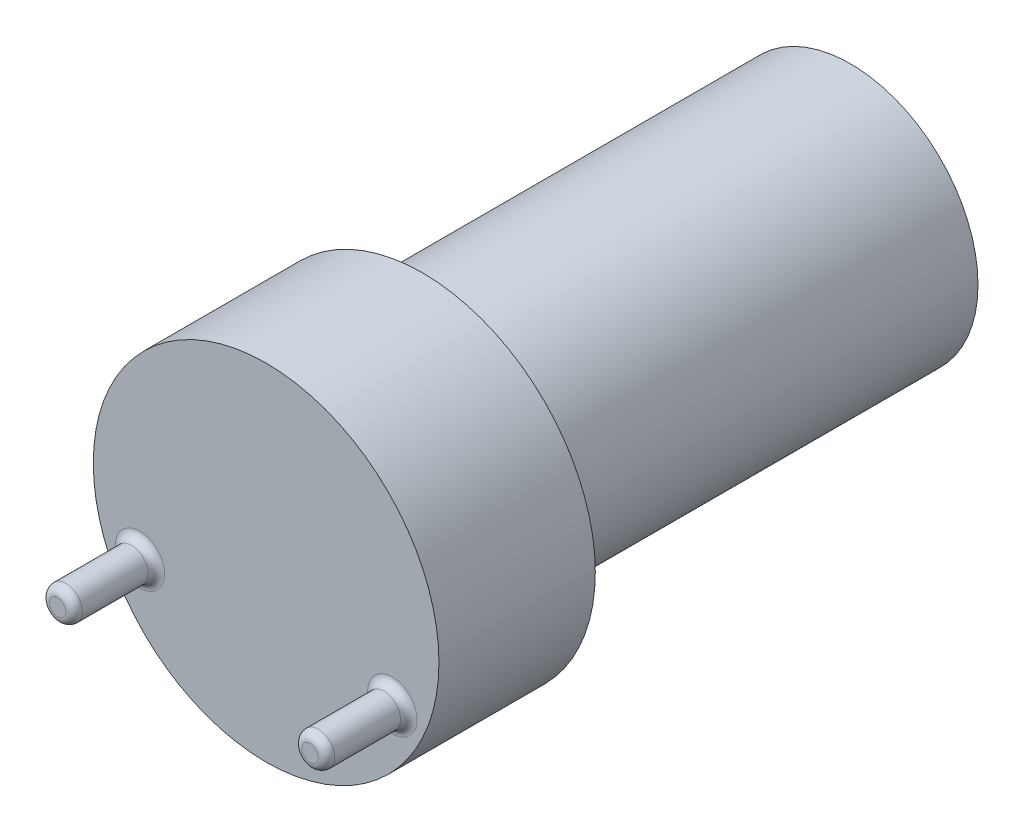
ISO-10303-21;
HEADER;
FILE_DESCRIPTION(('STEP AP214'),'2;1');
FILE_NAME('part.step','',(''),(''),'','','');
FILE_SCHEMA(('AUTOMOTIVE_DESIGN { 1 0 10303 214 1 1 1 1 }'));
ENDSEC;
DATA;
#1=APPLICATION_CONTEXT('core data for automotive mechanical design processes');
#2=APPLICATION_PROTOCOL_DEFINITION('international standard','automotive_design',2000,#1);
#3=PRODUCT_CONTEXT('',#1,'mechanical');
#4=PRODUCT('Part','Part','',(#3));
#5=PRODUCT_RELATED_PRODUCT_CATEGORY('part','',(#4));
#6=PRODUCT_DEFINITION_FORMATION('','',#4);
#7=PRODUCT_DEFINITION_CONTEXT('part definition',#1,'design');
#8=PRODUCT_DEFINITION('design','',#6,#7);
#9=PRODUCT_DEFINITION_SHAPE('','',#8);
#10=(LENGTH_UNIT() NAMED_UNIT(*) SI_UNIT(.MILLI.,.METRE.));
#11=(NAMED_UNIT(*) PLANE_ANGLE_UNIT() SI_UNIT($,.RADIAN.));
#12=(NAMED_UNIT(*) SI_UNIT($,.STERADIAN.) SOLID_ANGLE_UNIT());
#13=UNCERTAINTY_MEASURE_WITH_UNIT(LENGTH_MEASURE(1.E-05),#10,'distance_accuracy_value','');
#14=(GEOMETRIC_REPRESENTATION_CONTEXT(3) GLOBAL_UNCERTAINTY_ASSIGNED_CONTEXT((#13)) GLOBAL_UNIT_ASSIGNED_CONTEXT((#10,
#11,#12)) REPRESENTATION_CONTEXT('',''));
#15=CARTESIAN_POINT('',(0.,0.,0.));
#16=DIRECTION('',(0.,0.,1.));
#17=DIRECTION('',(1.,0.,0.));
#18=AXIS2_PLACEMENT_3D('',#15,#16,#17);
#19=CARTESIAN_POINT('',(0.,0.,52.));
#20=DIRECTION('',(0.,0.,-1.));
#21=DIRECTION('',(-1.,0.,0.));
#22=AXIS2_PLACEMENT_3D('',#19,#20,#21);
#23=CYLINDRICAL_SURFACE('',#22,15.5);
#24=CARTESIAN_POINT('',(0.,0.,52.));
#25=DIRECTION('',(0.,0.,1.));
#26=DIRECTION('',(1.,0.,0.));
#27=AXIS2_PLACEMENT_3D('',#24,#25,#26);
#28=CIRCLE('',#27,15.5);
#29=CARTESIAN_POINT('',(-15.5,0.,52.));
#30=VERTEX_POINT('',#29);
#31=EDGE_CURVE('E62',#30,#30,#28,.T.);
#32=CARTESIAN_POINT('',(0.,0.,0.));
#33=DIRECTION('',(0.,0.,1.));
#34=DIRECTION('',(1.,0.,0.));
#35=AXIS2_PLACEMENT_3D('',#32,#33,#34);
#36=CIRCLE('',#35,15.5);
#37=CARTESIAN_POINT('',(-15.5,0.,0.));
#38=VERTEX_POINT('',#37);
#39=EDGE_CURVE('E63',#38,#38,#36,.T.);
#40=CARTESIAN_POINT('',(-15.5,0.,52.));
#41=CARTESIAN_POINT('',(-15.5,0.,51.4583333333333));
#42=CARTESIAN_POINT('',(-15.5,0.,50.9166666666667));
#43=CARTESIAN_POINT('',(-15.5,0.,49.8333333333333));
#44=CARTESIAN_POINT('',(-15.5,0.,49.2916666666667));
#45=CARTESIAN_POINT('',(-15.5,0.,48.2083333333333));
#46=CARTESIAN_POINT('',(-15.5,0.,47.6666666666667));
#47=CARTESIAN_POINT('',(-15.5,0.,46.5833333333333));
#48=CARTESIAN_POINT('',(-15.5,0.,46.0416666666667));
#49=CARTESIAN_POINT('',(-15.5,0.,44.9583333333333));
#50=CARTESIAN_POINT('',(-15.5,0.,44.4166666666667));
#51=CARTESIAN_POINT('',(-15.5,0.,43.3333333333333));
#52=CARTESIAN_POINT('',(-15.5,0.,42.7916666666667));
#53=CARTESIAN_POINT('',(-15.5,0.,41.7083333333333));
#54=CARTESIAN_POINT('',(-15.5,0.,41.1666666666667));
#55=CARTESIAN_POINT('',(-15.5,0.,40.0833333333333));
#56=CARTESIAN_POINT('',(-15.5,0.,39.5416666666667));
#57=CARTESIAN_POINT('',(-15.5,0.,38.4583333333333));
#58=CARTESIAN_POINT('',(-15.5,0.,37.9166666666667));
#59=CARTESIAN_POINT('',(-15.5,0.,36.8333333333333));
#60=CARTESIAN_POINT('',(-15.5,0.,36.2916666666667));
#61=CARTESIAN_POINT('',(-15.5,0.,35.2083333333333));
#62=CARTESIAN_POINT('',(-15.5,0.,34.6666666666667));
#63=CARTESIAN_POINT('',(-15.5,0.,33.5833333333333));
#64=CARTESIAN_POINT('',(-15.5,0.,33.0416666666667));
#65=CARTESIAN_POINT('',(-15.5,0.,31.9583333333333));
#66=CARTESIAN_POINT('',(-15.5,0.,31.4166666666667));
#67=CARTESIAN_POINT('',(-15.5,0.,30.3333333333333));
#68=CARTESIAN_POINT('',(-15.5,0.,29.7916666666667));
#69=CARTESIAN_POINT('',(-15.5,0.,28.7083333333333));
#70=CARTESIAN_POINT('',(-15.5,0.,28.1666666666667));
#71=CARTESIAN_POINT('',(-15.5,0.,27.0833333333333));
#72=CARTESIAN_POINT('',(-15.5,0.,26.5416666666667));
#73=CARTESIAN_POINT('',(-15.5,0.,25.4583333333333));
#74=CARTESIAN_POINT('',(-15.5,0.,24.9166666666667));
#75=CARTESIAN_POINT('',(-15.5,0.,23.8333333333333));
#76=CARTESIAN_POINT('',(-15.5,0.,23.2916666666667));
#77=CARTESIAN_POINT('',(-15.5,0.,22.2083333333333));
#78=CARTESIAN_POINT('',(-15.5,0.,21.6666666666667));
#79=CARTESIAN_POINT('',(-15.5,0.,20.5833333333333));
#80=CARTESIAN_POINT('',(-15.5,0.,20.0416666666667));
#81=CARTESIAN_POINT('',(-15.5,0.,18.9583333333333));
#82=CARTESIAN_POINT('',(-15.5,0.,18.4166666666667));
#83=CARTESIAN_POINT('',(-15.5,0.,17.3333333333333));
#84=CARTESIAN_POINT('',(-15.5,0.,16.7916666666667));
#85=CARTESIAN_POINT('',(-15.5,0.,15.7083333333333));
#86=CARTESIAN_POINT('',(-15.5,0.,15.1666666666667));
#87=CARTESIAN_POINT('',(-15.5,0.,14.0833333333333));
#88=CARTESIAN_POINT('',(-15.5,0.,13.5416666666667));
#89=CARTESIAN_POINT('',(-15.5,0.,12.4583333333333));
#90=CARTESIAN_POINT('',(-15.5,0.,11.9166666666667));
#91=CARTESIAN_POINT('',(-15.5,0.,10.8333333333333));
#92=CARTESIAN_POINT('',(-15.5,0.,10.2916666666667));
#93=CARTESIAN_POINT('',(-15.5,0.,9.20833333333333));
#94=CARTESIAN_POINT('',(-15.5,0.,8.66666666666667));
#95=CARTESIAN_POINT('',(-15.5,0.,7.58333333333333));
#96=CARTESIAN_POINT('',(-15.5,0.,7.04166666666667));
#97=CARTESIAN_POINT('',(-15.5,0.,5.95833333333333));
#98=CARTESIAN_POINT('',(-15.5,0.,5.41666666666667));
#99=CARTESIAN_POINT('',(-15.5,0.,4.33333333333333));
#100=CARTESIAN_POINT('',(-15.5,0.,3.79166666666667));
#101=CARTESIAN_POINT('',(-15.5,0.,2.70833333333334));
#102=CARTESIAN_POINT('',(-15.5,0.,2.16666666666667));
#103=CARTESIAN_POINT('',(-15.5,0.,1.08333333333333));
#104=CARTESIAN_POINT('',(-15.5,0.,0.541666666666667));
#105=CARTESIAN_POINT('',(-15.5,0.,0.));
#106=B_SPLINE_CURVE_WITH_KNOTS('',3,(#40,#41,#42,#43,#44,#45,#46,#47,#48,#49,#50,#51,#52,#53,
#54,#55,#56,#57,#58,#59,#60,#61,#62,#63,#64,#65,#66,#67,#68,#69,#70,#71,#72,#73,#74,#75,#76,#77,
#78,#79,#80,#81,#82,#83,#84,#85,#86,#87,#88,#89,#90,#91,#92,#93,#94,#95,#96,#97,#98,#99,#100,
#101,#102,#103,#104,#105),.UNSPECIFIED.,.F.,.F.,(4,2,2,2,2,2,2,2,2,2,2,2,2,2,2,2,2,2,2,2,2,2,2,
2,2,2,2,2,2,2,2,2,4),(0.,1.62499999999999,3.25,4.875,6.49999999999999,8.12499999999999,
9.74999999999999,11.375,13.,14.625,16.25,17.875,19.5,21.125,22.75,24.375,26.,27.625,29.25,
30.875,32.5,34.125,35.75,37.375,39.,40.625,42.25,43.875,45.5,47.125,48.75,50.375,52.),.UNSPECIFIED.);
#107=EDGE_CURVE('BSEAM30',#30,#38,#106,.T.);
#108=ORIENTED_EDGE('',*,*,#31,.F.);
#109=ORIENTED_EDGE('',*,*,#39,.T.);
#110=ORIENTED_EDGE('',*,*,#107,.T.);
#111=ORIENTED_EDGE('',*,*,#107,.F.);
#112=EDGE_LOOP('',(#108,#110,#109,#111));
#113=FACE_BOUND('',#112,.T.);
#114=ADVANCED_FACE('F30',(#113),#23,.T.);
#115=CARTESIAN_POINT('',(0.,0.,0.));
#116=DIRECTION('',(0.,0.,1.));
#117=DIRECTION('',(1.,0.,0.));
#118=AXIS2_PLACEMENT_3D('',#115,#116,#117);
#119=PLANE('',#118);
#120=ORIENTED_EDGE('',*,*,#39,.F.);
#121=EDGE_LOOP('',(#120));
#122=FACE_BOUND('',#121,.T.);
#123=ADVANCED_FACE('F80',(#122),#119,.F.);
#124=CARTESIAN_POINT('',(0.,-1.5,71.));
#125=DIRECTION('',(0.,0.,-1.));
#126=DIRECTION('',(-1.,0.,0.));
#127=AXIS2_PLACEMENT_3D('',#124,#125,#126);
#128=CYLINDRICAL_SURFACE('',#127,21.);
#129=CARTESIAN_POINT('',(0.,-1.5,71.));
#130=DIRECTION('',(0.,0.,1.));
#131=DIRECTION('',(1.,0.,0.));
#132=AXIS2_PLACEMENT_3D('',#129,#130,#131);
#133=CIRCLE('',#132,21.);
#134=CARTESIAN_POINT('',(21.,-1.5,71.));
#135=VERTEX_POINT('',#134);
#136=EDGE_CURVE('E66',#135,#135,#133,.T.);
#137=ORIENTED_EDGE('',*,*,#136,.F.);
#138=EDGE_LOOP('',(#137));
#139=FACE_BOUND('',#138,.T.);
#140=CARTESIAN_POINT('',(0.,-1.5,52.));
#141=DIRECTION('',(0.,0.,1.));
#142=DIRECTION('',(1.,0.,0.));
#143=AXIS2_PLACEMENT_3D('',#140,#141,#142);
#144=CIRCLE('',#143,21.);
#145=CARTESIAN_POINT('',(21.,-1.5,52.));
#146=VERTEX_POINT('',#145);
#147=EDGE_CURVE('E69',#146,#146,#144,.T.);
#148=ORIENTED_EDGE('',*,*,#147,.T.);
#149=EDGE_LOOP('',(#148));
#150=FACE_BOUND('',#149,.T.);
#151=ADVANCED_FACE('F77',(#139,#150),#128,.T.);
#152=CARTESIAN_POINT('',(0.,-1.5,71.));
#153=DIRECTION('',(0.,0.,1.));
#154=DIRECTION('',(1.,0.,0.));
#155=AXIS2_PLACEMENT_3D('',#152,#153,#154);
#156=PLANE('',#155);
#157=CARTESIAN_POINT('',(-15.337121903122,-8.85489145936155,71.));
#158=DIRECTION('',(0.,0.,1.));
#159=DIRECTION('',(1.,0.,0.));
#160=AXIS2_PLACEMENT_3D('',#157,#158,#159);
#161=CIRCLE('',#160,3.);
#162=CARTESIAN_POINT('',(-12.337121903122,-8.85489145936155,71.));
#163=VERTEX_POINT('',#162);
#164=EDGE_CURVE('E10',#163,#163,#161,.F.);
#165=ORIENTED_EDGE('',*,*,#164,.T.);
#166=EDGE_LOOP('',(#165));
#167=FACE_BOUND('',#166,.T.);
#168=CARTESIAN_POINT('',(15.337121903122,-8.85489145936155,71.));
#169=DIRECTION('',(0.,0.,1.));
#170=DIRECTION('',(1.,0.,0.));
#171=AXIS2_PLACEMENT_3D('',#168,#169,#170);
#172=CIRCLE('',#171,3.00000000000001);
#173=CARTESIAN_POINT('',(18.337121903122,-8.85489145936155,71.));
#174=VERTEX_POINT('',#173);
#175=EDGE_CURVE('E37',#174,#174,#172,.F.);
#176=ORIENTED_EDGE('',*,*,#175,.T.);
#177=EDGE_LOOP('',(#176));
#178=FACE_BOUND('',#177,.T.);
#179=ORIENTED_EDGE('',*,*,#136,.T.);
#180=EDGE_LOOP('',(#179));
#181=FACE_BOUND('',#180,.T.);
#182=ADVANCED_FACE('F75',(#167,#178,#181),#156,.T.);
#183=CARTESIAN_POINT('',(0.,-1.5,52.));
#184=DIRECTION('',(0.,0.,1.));
#185=DIRECTION('',(1.,0.,0.));
#186=AXIS2_PLACEMENT_3D('',#183,#184,#185);
#187=PLANE('',#186);
#188=ORIENTED_EDGE('',*,*,#31,.T.);
#189=EDGE_LOOP('',(#188));
#190=FACE_BOUND('',#189,.T.);
#191=ORIENTED_EDGE('',*,*,#147,.F.);
#192=EDGE_LOOP('',(#191));
#193=FACE_BOUND('',#192,.T.);
#194=ADVANCED_FACE('F84',(#190,#193),#187,.F.);
#195=CARTESIAN_POINT('',(-15.337121903122,-8.85489145936155,81.));
#196=DIRECTION('',(0.,0.,-1.));
#197=DIRECTION('',(-1.,0.,0.));
#198=AXIS2_PLACEMENT_3D('',#195,#196,#197);
#199=CYLINDRICAL_SURFACE('',#198,2.);
#200=CARTESIAN_POINT('',(-15.337121903122,-8.85489145936155,80.));
#201=DIRECTION('',(0.,0.,1.));
#202=DIRECTION('',(1.,0.,0.));
#203=AXIS2_PLACEMENT_3D('',#200,#201,#202);
#204=CIRCLE('',#203,2.);
#205=CARTESIAN_POINT('',(-13.337121903122,-8.85489145936155,80.));
#206=VERTEX_POINT('',#205);
#207=EDGE_CURVE('E41',#206,#206,#204,.F.);
#208=ORIENTED_EDGE('',*,*,#207,.T.);
#209=EDGE_LOOP('',(#208));
#210=FACE_BOUND('',#209,.T.);
#211=CARTESIAN_POINT('',(-15.337121903122,-8.85489145936155,72.));
#212=DIRECTION('',(0.,0.,1.));
#213=DIRECTION('',(1.,0.,0.));
#214=AXIS2_PLACEMENT_3D('',#211,#212,#213);
#215=CIRCLE('',#214,2.);
#216=CARTESIAN_POINT('',(-13.337121903122,-8.85489145936155,72.));
#217=VERTEX_POINT('',#216);
#218=EDGE_CURVE('E45',#217,#217,#215,.T.);
#219=ORIENTED_EDGE('',*,*,#218,.T.);
#220=EDGE_LOOP('',(#219));
#221=FACE_BOUND('',#220,.T.);
#222=ADVANCED_FACE('F86',(#210,#221),#199,.T.);
#223=CARTESIAN_POINT('',(-15.337121903122,-8.85489145936155,81.));
#224=DIRECTION('',(0.,0.,1.));
#225=DIRECTION('',(1.,0.,0.));
#226=AXIS2_PLACEMENT_3D('',#223,#224,#225);
#227=PLANE('',#226);
#228=CARTESIAN_POINT('',(-15.337121903122,-8.85489145936155,81.));
#229=DIRECTION('',(0.,0.,1.));
#230=DIRECTION('',(1.,0.,0.));
#231=AXIS2_PLACEMENT_3D('',#228,#229,#230);
#232=CIRCLE('',#231,1.);
#233=CARTESIAN_POINT('',(-14.337121903122,-8.85489145936155,81.));
#234=VERTEX_POINT('',#233);
#235=EDGE_CURVE('E50',#234,#234,#232,.T.);
#236=ORIENTED_EDGE('',*,*,#235,.T.);
#237=EDGE_LOOP('',(#236));
#238=FACE_BOUND('',#237,.T.);
#239=ADVANCED_FACE('F93',(#238),#227,.T.);
#240=CARTESIAN_POINT('',(15.337121903122,-8.85489145936155,81.));
#241=DIRECTION('',(0.,0.,-1.));
#242=DIRECTION('',(-1.,0.,0.));
#243=AXIS2_PLACEMENT_3D('',#240,#241,#242);
#244=CYLINDRICAL_SURFACE('',#243,2.00000000000001);
#245=CARTESIAN_POINT('',(15.337121903122,-8.85489145936155,80.));
#246=DIRECTION('',(0.,0.,-1.));
#247=DIRECTION('',(-1.,0.,0.));
#248=AXIS2_PLACEMENT_3D('',#245,#246,#247);
#249=CIRCLE('',#248,2.00000000000001);
#250=CARTESIAN_POINT('',(13.337121903122,-8.85489145936155,80.));
#251=VERTEX_POINT('',#250);
#252=EDGE_CURVE('E53',#251,#251,#249,.T.);
#253=ORIENTED_EDGE('',*,*,#252,.T.);
#254=EDGE_LOOP('',(#253));
#255=FACE_BOUND('',#254,.T.);
#256=CARTESIAN_POINT('',(15.337121903122,-8.85489145936155,72.));
#257=DIRECTION('',(0.,0.,1.));
#258=DIRECTION('',(1.,0.,0.));
#259=AXIS2_PLACEMENT_3D('',#256,#257,#258);
#260=CIRCLE('',#259,2.00000000000001);
#261=CARTESIAN_POINT('',(17.337121903122,-8.85489145936155,72.));
#262=VERTEX_POINT('',#261);
#263=EDGE_CURVE('E56',#262,#262,#260,.T.);
#264=ORIENTED_EDGE('',*,*,#263,.T.);
#265=EDGE_LOOP('',(#264));
#266=FACE_BOUND('',#265,.T.);
#267=ADVANCED_FACE('F131',(#255,#266),#244,.T.);
#268=CARTESIAN_POINT('',(15.337121903122,-8.85489145936155,81.));
#269=DIRECTION('',(0.,0.,-1.));
#270=DIRECTION('',(-1.,0.,0.));
#271=AXIS2_PLACEMENT_3D('',#268,#269,#270);
#272=PLANE('',#271);
#273=CARTESIAN_POINT('',(15.337121903122,-8.85489145936155,81.));
#274=DIRECTION('',(0.,0.,-1.));
#275=DIRECTION('',(-1.,0.,0.));
#276=AXIS2_PLACEMENT_3D('',#273,#274,#275);
#277=CIRCLE('',#276,1.00000000000001);
#278=CARTESIAN_POINT('',(14.337121903122,-8.85489145936155,81.));
#279=VERTEX_POINT('',#278);
#280=EDGE_CURVE('E59',#279,#279,#277,.F.);
#281=ORIENTED_EDGE('',*,*,#280,.T.);
#282=EDGE_LOOP('',(#281));
#283=FACE_BOUND('',#282,.T.);
#284=ADVANCED_FACE('F112',(#283),#272,.F.);
#285=CARTESIAN_POINT('',(15.337121903122,-8.85489145936155,80.));
#286=DIRECTION('',(0.,0.,-1.));
#287=DIRECTION('',(-1.,0.,0.));
#288=AXIS2_PLACEMENT_3D('',#285,#286,#287);
#289=TOROIDAL_SURFACE('',#288,1.00000000000001,1.);
#290=ORIENTED_EDGE('',*,*,#252,.F.);
#291=EDGE_LOOP('',(#290));
#292=FACE_BOUND('',#291,.T.);
#293=ORIENTED_EDGE('',*,*,#280,.F.);
#294=EDGE_LOOP('',(#293));
#295=FACE_BOUND('',#294,.T.);
#296=ADVANCED_FACE('F108',(#292,#295),#289,.T.);
#297=CARTESIAN_POINT('',(-15.337121903122,-8.85489145936155,80.));
#298=DIRECTION('',(0.,0.,1.));
#299=DIRECTION('',(1.,0.,0.));
#300=AXIS2_PLACEMENT_3D('',#297,#298,#299);
#301=DEGENERATE_TOROIDAL_SURFACE('',#300,1.,1.,.T.);
#302=ORIENTED_EDGE('',*,*,#207,.F.);
#303=EDGE_LOOP('',(#302));
#304=FACE_BOUND('',#303,.T.);
#305=ORIENTED_EDGE('',*,*,#235,.F.);
#306=EDGE_LOOP('',(#305));
#307=FACE_BOUND('',#306,.T.);
#308=ADVANCED_FACE('F111',(#304,#307),#301,.T.);
#309=CARTESIAN_POINT('',(-15.337121903122,-8.85489145936155,72.));
#310=DIRECTION('',(0.,0.,1.));
#311=DIRECTION('',(1.,0.,0.));
#312=AXIS2_PLACEMENT_3D('',#309,#310,#311);
#313=TOROIDAL_SURFACE('',#312,3.,1.);
#314=ORIENTED_EDGE('',*,*,#164,.F.);
#315=EDGE_LOOP('',(#314));
#316=FACE_BOUND('',#315,.T.);
#317=ORIENTED_EDGE('',*,*,#218,.F.);
#318=EDGE_LOOP('',(#317));
#319=FACE_BOUND('',#318,.T.);
#320=ADVANCED_FACE('F115',(#316,#319),#313,.F.);
#321=CARTESIAN_POINT('',(15.337121903122,-8.85489145936155,72.));
#322=DIRECTION('',(0.,0.,1.));
#323=DIRECTION('',(1.,0.,0.));
#324=AXIS2_PLACEMENT_3D('',#321,#322,#323);
#325=TOROIDAL_SURFACE('',#324,3.00000000000001,1.);
#326=ORIENTED_EDGE('',*,*,#175,.F.);
#327=EDGE_LOOP('',(#326));
#328=FACE_BOUND('',#327,.T.);
#329=ORIENTED_EDGE('',*,*,#263,.F.);
#330=EDGE_LOOP('',(#329));
#331=FACE_BOUND('',#330,.T.);
#332=ADVANCED_FACE('F32',(#328,#331),#325,.F.);
#333=CLOSED_SHELL('',(#114,#123,#151,#182,#194,#222,#239,#267,#284,#296,#308,#320,#332));
#334=MANIFOLD_SOLID_BREP('B2',#333);
#335=ADVANCED_BREP_SHAPE_REPRESENTATION('',(#18,#334),#14);
#336=SHAPE_DEFINITION_REPRESENTATION(#9,#335);
ENDSEC;
END-ISO-10303-21;
